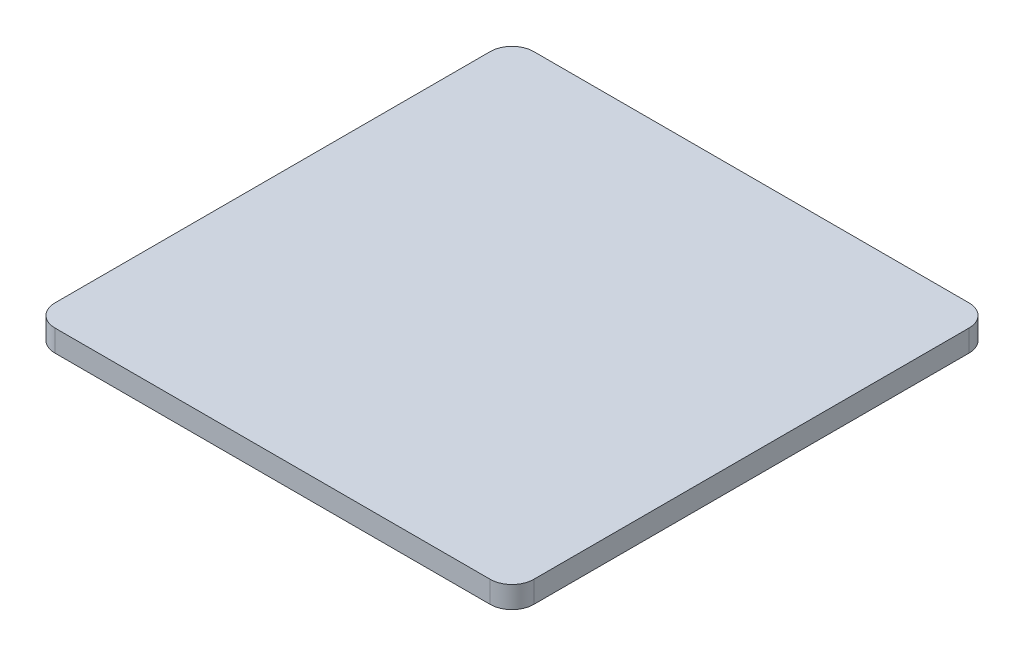
ISO-10303-21;
HEADER;
FILE_DESCRIPTION(('STEP AP214'),'2;1');
FILE_NAME('part.step','',(''),(''),'','','');
FILE_SCHEMA(('AUTOMOTIVE_DESIGN { 1 0 10303 214 1 1 1 1 }'));
ENDSEC;
DATA;
#1=APPLICATION_CONTEXT('core data for automotive mechanical design processes');
#2=APPLICATION_PROTOCOL_DEFINITION('international standard','automotive_design',2000,#1);
#3=PRODUCT_CONTEXT('',#1,'mechanical');
#4=PRODUCT('Part','Part','',(#3));
#5=PRODUCT_RELATED_PRODUCT_CATEGORY('part','',(#4));
#6=PRODUCT_DEFINITION_FORMATION('','',#4);
#7=PRODUCT_DEFINITION_CONTEXT('part definition',#1,'design');
#8=PRODUCT_DEFINITION('design','',#6,#7);
#9=PRODUCT_DEFINITION_SHAPE('','',#8);
#10=(LENGTH_UNIT() NAMED_UNIT(*) SI_UNIT(.MILLI.,.METRE.));
#11=(NAMED_UNIT(*) PLANE_ANGLE_UNIT() SI_UNIT($,.RADIAN.));
#12=(NAMED_UNIT(*) SI_UNIT($,.STERADIAN.) SOLID_ANGLE_UNIT());
#13=UNCERTAINTY_MEASURE_WITH_UNIT(LENGTH_MEASURE(1.E-05),#10,'distance_accuracy_value','');
#14=(GEOMETRIC_REPRESENTATION_CONTEXT(3) GLOBAL_UNCERTAINTY_ASSIGNED_CONTEXT((#13)) GLOBAL_UNIT_ASSIGNED_CONTEXT((#10,
#11,#12)) REPRESENTATION_CONTEXT('',''));
#15=CARTESIAN_POINT('',(0.,0.,0.));
#16=DIRECTION('',(0.,0.,1.));
#17=DIRECTION('',(1.,0.,0.));
#18=AXIS2_PLACEMENT_3D('',#15,#16,#17);
#19=CARTESIAN_POINT('',(110.,10.,110.));
#20=DIRECTION('',(-1.,0.,0.));
#21=DIRECTION('',(0.,0.,1.));
#22=AXIS2_PLACEMENT_3D('',#19,#20,#21);
#23=PLANE('',#22);
#24=DIRECTION('',(0.,0.,-1.));
#25=VECTOR('',#24,1.);
#26=CARTESIAN_POINT('',(110.,10.,110.));
#27=LINE('',#26,#25);
#28=CARTESIAN_POINT('',(110.,10.,100.));
#29=VERTEX_POINT('',#28);
#30=CARTESIAN_POINT('',(110.,10.,-100.));
#31=VERTEX_POINT('',#30);
#32=EDGE_CURVE('E129',#29,#31,#27,.T.);
#33=ORIENTED_EDGE('',*,*,#32,.F.);
#34=DIRECTION('',(0.,-1.,0.));
#35=VECTOR('',#34,1.);
#36=CARTESIAN_POINT('',(110.,10.,100.));
#37=LINE('',#36,#35);
#38=CARTESIAN_POINT('',(110.,0.,100.));
#39=VERTEX_POINT('',#38);
#40=EDGE_CURVE('E155',#29,#39,#37,.T.);
#41=ORIENTED_EDGE('',*,*,#40,.T.);
#42=DIRECTION('',(0.,0.,-1.));
#43=VECTOR('',#42,1.);
#44=CARTESIAN_POINT('',(110.,0.,110.));
#45=LINE('',#44,#43);
#46=CARTESIAN_POINT('',(110.,0.,-100.));
#47=VERTEX_POINT('',#46);
#48=EDGE_CURVE('E161',#39,#47,#45,.T.);
#49=ORIENTED_EDGE('',*,*,#48,.T.);
#50=DIRECTION('',(0.,-1.,0.));
#51=VECTOR('',#50,1.);
#52=CARTESIAN_POINT('',(110.,10.,-100.));
#53=LINE('',#52,#51);
#54=EDGE_CURVE('E153',#47,#31,#53,.F.);
#55=ORIENTED_EDGE('',*,*,#54,.T.);
#56=EDGE_LOOP('',(#33,#41,#49,#55));
#57=FACE_BOUND('',#56,.T.);
#58=ADVANCED_FACE('F37',(#57),#23,.F.);
#59=CARTESIAN_POINT('',(-110.,10.,-110.));
#60=DIRECTION('',(0.,0.,1.));
#61=DIRECTION('',(1.,0.,0.));
#62=AXIS2_PLACEMENT_3D('',#59,#60,#61);
#63=PLANE('',#62);
#64=DIRECTION('',(-1.,0.,0.));
#65=VECTOR('',#64,1.);
#66=CARTESIAN_POINT('',(-110.,10.,-110.));
#67=LINE('',#66,#65);
#68=CARTESIAN_POINT('',(100.,10.,-110.));
#69=VERTEX_POINT('',#68);
#70=CARTESIAN_POINT('',(-100.,10.,-110.));
#71=VERTEX_POINT('',#70);
#72=EDGE_CURVE('E132',#69,#71,#67,.T.);
#73=ORIENTED_EDGE('',*,*,#72,.F.);
#74=DIRECTION('',(0.,-1.,0.));
#75=VECTOR('',#74,1.);
#76=CARTESIAN_POINT('',(100.,10.,-110.));
#77=LINE('',#76,#75);
#78=CARTESIAN_POINT('',(100.,0.,-110.));
#79=VERTEX_POINT('',#78);
#80=EDGE_CURVE('E11',#69,#79,#77,.T.);
#81=ORIENTED_EDGE('',*,*,#80,.T.);
#82=DIRECTION('',(-1.,0.,0.));
#83=VECTOR('',#82,1.);
#84=CARTESIAN_POINT('',(-110.,0.,-110.));
#85=LINE('',#84,#83);
#86=CARTESIAN_POINT('',(-100.,0.,-110.));
#87=VERTEX_POINT('',#86);
#88=EDGE_CURVE('E134',#79,#87,#85,.T.);
#89=ORIENTED_EDGE('',*,*,#88,.T.);
#90=DIRECTION('',(0.,-1.,0.));
#91=VECTOR('',#90,1.);
#92=CARTESIAN_POINT('',(-100.,10.,-110.));
#93=LINE('',#92,#91);
#94=EDGE_CURVE('E45',#87,#71,#93,.F.);
#95=ORIENTED_EDGE('',*,*,#94,.T.);
#96=EDGE_LOOP('',(#73,#81,#89,#95));
#97=FACE_BOUND('',#96,.T.);
#98=ADVANCED_FACE('F180',(#97),#63,.F.);
#99=CARTESIAN_POINT('',(-110.,10.,110.));
#100=DIRECTION('',(1.,0.,0.));
#101=DIRECTION('',(0.,0.,-1.));
#102=AXIS2_PLACEMENT_3D('',#99,#100,#101);
#103=PLANE('',#102);
#104=DIRECTION('',(0.,0.,1.));
#105=VECTOR('',#104,1.);
#106=CARTESIAN_POINT('',(-110.,0.,110.));
#107=LINE('',#106,#105);
#108=CARTESIAN_POINT('',(-110.,0.,-100.));
#109=VERTEX_POINT('',#108);
#110=CARTESIAN_POINT('',(-110.,0.,100.));
#111=VERTEX_POINT('',#110);
#112=EDGE_CURVE('E130',#109,#111,#107,.T.);
#113=ORIENTED_EDGE('',*,*,#112,.T.);
#114=DIRECTION('',(0.,-1.,0.));
#115=VECTOR('',#114,1.);
#116=CARTESIAN_POINT('',(-110.,10.,100.));
#117=LINE('',#116,#115);
#118=CARTESIAN_POINT('',(-110.,10.,100.));
#119=VERTEX_POINT('',#118);
#120=EDGE_CURVE('E108',#111,#119,#117,.F.);
#121=ORIENTED_EDGE('',*,*,#120,.T.);
#122=DIRECTION('',(0.,0.,1.));
#123=VECTOR('',#122,1.);
#124=CARTESIAN_POINT('',(-110.,10.,110.));
#125=LINE('',#124,#123);
#126=CARTESIAN_POINT('',(-110.,10.,-100.));
#127=VERTEX_POINT('',#126);
#128=EDGE_CURVE('E169',#127,#119,#125,.T.);
#129=ORIENTED_EDGE('',*,*,#128,.F.);
#130=DIRECTION('',(0.,-1.,0.));
#131=VECTOR('',#130,1.);
#132=CARTESIAN_POINT('',(-110.,10.,-100.));
#133=LINE('',#132,#131);
#134=EDGE_CURVE('E113',#127,#109,#133,.T.);
#135=ORIENTED_EDGE('',*,*,#134,.T.);
#136=EDGE_LOOP('',(#113,#121,#129,#135));
#137=FACE_BOUND('',#136,.T.);
#138=ADVANCED_FACE('F179',(#137),#103,.F.);
#139=CARTESIAN_POINT('',(-110.,10.,110.));
#140=DIRECTION('',(0.,0.,-1.));
#141=DIRECTION('',(-1.,0.,0.));
#142=AXIS2_PLACEMENT_3D('',#139,#140,#141);
#143=PLANE('',#142);
#144=DIRECTION('',(1.,0.,0.));
#145=VECTOR('',#144,1.);
#146=CARTESIAN_POINT('',(-110.,10.,110.));
#147=LINE('',#146,#145);
#148=CARTESIAN_POINT('',(-100.,10.,110.));
#149=VERTEX_POINT('',#148);
#150=CARTESIAN_POINT('',(100.,10.,110.));
#151=VERTEX_POINT('',#150);
#152=EDGE_CURVE('E123',#149,#151,#147,.T.);
#153=ORIENTED_EDGE('',*,*,#152,.F.);
#154=DIRECTION('',(0.,-1.,0.));
#155=VECTOR('',#154,1.);
#156=CARTESIAN_POINT('',(-100.,10.,110.));
#157=LINE('',#156,#155);
#158=CARTESIAN_POINT('',(-100.,0.,110.));
#159=VERTEX_POINT('',#158);
#160=EDGE_CURVE('E107',#149,#159,#157,.T.);
#161=ORIENTED_EDGE('',*,*,#160,.T.);
#162=DIRECTION('',(1.,0.,0.));
#163=VECTOR('',#162,1.);
#164=CARTESIAN_POINT('',(-110.,0.,110.));
#165=LINE('',#164,#163);
#166=CARTESIAN_POINT('',(100.,0.,110.));
#167=VERTEX_POINT('',#166);
#168=EDGE_CURVE('E120',#159,#167,#165,.T.);
#169=ORIENTED_EDGE('',*,*,#168,.T.);
#170=DIRECTION('',(0.,-1.,0.));
#171=VECTOR('',#170,1.);
#172=CARTESIAN_POINT('',(100.,10.,110.));
#173=LINE('',#172,#171);
#174=EDGE_CURVE('E125',#167,#151,#173,.F.);
#175=ORIENTED_EDGE('',*,*,#174,.T.);
#176=EDGE_LOOP('',(#153,#161,#169,#175));
#177=FACE_BOUND('',#176,.T.);
#178=ADVANCED_FACE('F119',(#177),#143,.F.);
#179=CARTESIAN_POINT('',(0.,10.,0.));
#180=DIRECTION('',(0.,-1.,0.));
#181=DIRECTION('',(0.,0.,-1.));
#182=AXIS2_PLACEMENT_3D('',#179,#180,#181);
#183=PLANE('',#182);
#184=ORIENTED_EDGE('',*,*,#128,.T.);
#185=CARTESIAN_POINT('',(-100.,10.,100.));
#186=DIRECTION('',(0.,-1.,0.));
#187=DIRECTION('',(0.,0.,-1.));
#188=AXIS2_PLACEMENT_3D('',#185,#186,#187);
#189=CIRCLE('',#188,10.);
#190=EDGE_CURVE('E151',#119,#149,#189,.F.);
#191=ORIENTED_EDGE('',*,*,#190,.T.);
#192=ORIENTED_EDGE('',*,*,#152,.T.);
#193=CARTESIAN_POINT('',(100.,10.,100.));
#194=DIRECTION('',(0.,-1.,0.));
#195=DIRECTION('',(0.,0.,-1.));
#196=AXIS2_PLACEMENT_3D('',#193,#194,#195);
#197=CIRCLE('',#196,10.);
#198=EDGE_CURVE('E149',#151,#29,#197,.F.);
#199=ORIENTED_EDGE('',*,*,#198,.T.);
#200=ORIENTED_EDGE('',*,*,#32,.T.);
#201=CARTESIAN_POINT('',(100.,10.,-100.));
#202=DIRECTION('',(0.,-1.,0.));
#203=DIRECTION('',(0.,0.,-1.));
#204=AXIS2_PLACEMENT_3D('',#201,#202,#203);
#205=CIRCLE('',#204,10.);
#206=EDGE_CURVE('E58',#31,#69,#205,.F.);
#207=ORIENTED_EDGE('',*,*,#206,.T.);
#208=ORIENTED_EDGE('',*,*,#72,.T.);
#209=CARTESIAN_POINT('',(-100.,10.,-100.));
#210=DIRECTION('',(0.,-1.,0.));
#211=DIRECTION('',(0.,0.,-1.));
#212=AXIS2_PLACEMENT_3D('',#209,#210,#211);
#213=CIRCLE('',#212,10.);
#214=EDGE_CURVE('E146',#71,#127,#213,.F.);
#215=ORIENTED_EDGE('',*,*,#214,.T.);
#216=EDGE_LOOP('',(#184,#191,#192,#199,#200,#207,#208,#215));
#217=FACE_BOUND('',#216,.T.);
#218=ADVANCED_FACE('F173',(#217),#183,.F.);
#219=CARTESIAN_POINT('',(0.,0.,0.));
#220=DIRECTION('',(0.,-1.,0.));
#221=DIRECTION('',(0.,0.,-1.));
#222=AXIS2_PLACEMENT_3D('',#219,#220,#221);
#223=PLANE('',#222);
#224=ORIENTED_EDGE('',*,*,#168,.F.);
#225=CARTESIAN_POINT('',(-100.,0.,100.));
#226=DIRECTION('',(0.,-1.,0.));
#227=DIRECTION('',(0.,0.,-1.));
#228=AXIS2_PLACEMENT_3D('',#225,#226,#227);
#229=CIRCLE('',#228,10.);
#230=EDGE_CURVE('E103',#159,#111,#229,.T.);
#231=ORIENTED_EDGE('',*,*,#230,.T.);
#232=ORIENTED_EDGE('',*,*,#112,.F.);
#233=CARTESIAN_POINT('',(-100.,0.,-100.));
#234=DIRECTION('',(0.,-1.,0.));
#235=DIRECTION('',(0.,0.,-1.));
#236=AXIS2_PLACEMENT_3D('',#233,#234,#235);
#237=CIRCLE('',#236,10.);
#238=EDGE_CURVE('E124',#109,#87,#237,.T.);
#239=ORIENTED_EDGE('',*,*,#238,.T.);
#240=ORIENTED_EDGE('',*,*,#88,.F.);
#241=CARTESIAN_POINT('',(100.,0.,-100.));
#242=DIRECTION('',(0.,-1.,0.));
#243=DIRECTION('',(0.,0.,-1.));
#244=AXIS2_PLACEMENT_3D('',#241,#242,#243);
#245=CIRCLE('',#244,10.);
#246=EDGE_CURVE('E140',#79,#47,#245,.T.);
#247=ORIENTED_EDGE('',*,*,#246,.T.);
#248=ORIENTED_EDGE('',*,*,#48,.F.);
#249=CARTESIAN_POINT('',(100.,0.,100.));
#250=DIRECTION('',(0.,-1.,0.));
#251=DIRECTION('',(0.,0.,-1.));
#252=AXIS2_PLACEMENT_3D('',#249,#250,#251);
#253=CIRCLE('',#252,10.);
#254=EDGE_CURVE('E114',#39,#167,#253,.T.);
#255=ORIENTED_EDGE('',*,*,#254,.T.);
#256=EDGE_LOOP('',(#224,#231,#232,#239,#240,#247,#248,#255));
#257=FACE_BOUND('',#256,.T.);
#258=ADVANCED_FACE('F127',(#257),#223,.T.);
#259=CARTESIAN_POINT('',(-100.,10.,100.));
#260=DIRECTION('',(0.,-1.,0.));
#261=DIRECTION('',(0.,0.,-1.));
#262=AXIS2_PLACEMENT_3D('',#259,#260,#261);
#263=CYLINDRICAL_SURFACE('',#262,10.);
#264=ORIENTED_EDGE('',*,*,#190,.F.);
#265=ORIENTED_EDGE('',*,*,#120,.F.);
#266=ORIENTED_EDGE('',*,*,#230,.F.);
#267=ORIENTED_EDGE('',*,*,#160,.F.);
#268=EDGE_LOOP('',(#264,#265,#266,#267));
#269=FACE_BOUND('',#268,.T.);
#270=ADVANCED_FACE('F106',(#269),#263,.T.);
#271=CARTESIAN_POINT('',(100.,10.,100.));
#272=DIRECTION('',(0.,-1.,0.));
#273=DIRECTION('',(0.,0.,-1.));
#274=AXIS2_PLACEMENT_3D('',#271,#272,#273);
#275=CYLINDRICAL_SURFACE('',#274,10.);
#276=ORIENTED_EDGE('',*,*,#198,.F.);
#277=ORIENTED_EDGE('',*,*,#174,.F.);
#278=ORIENTED_EDGE('',*,*,#254,.F.);
#279=ORIENTED_EDGE('',*,*,#40,.F.);
#280=EDGE_LOOP('',(#276,#277,#278,#279));
#281=FACE_BOUND('',#280,.T.);
#282=ADVANCED_FACE('F183',(#281),#275,.T.);
#283=CARTESIAN_POINT('',(100.,10.,-100.));
#284=DIRECTION('',(0.,-1.,0.));
#285=DIRECTION('',(0.,0.,-1.));
#286=AXIS2_PLACEMENT_3D('',#283,#284,#285);
#287=CYLINDRICAL_SURFACE('',#286,10.);
#288=ORIENTED_EDGE('',*,*,#206,.F.);
#289=ORIENTED_EDGE('',*,*,#54,.F.);
#290=ORIENTED_EDGE('',*,*,#246,.F.);
#291=ORIENTED_EDGE('',*,*,#80,.F.);
#292=EDGE_LOOP('',(#288,#289,#290,#291));
#293=FACE_BOUND('',#292,.T.);
#294=ADVANCED_FACE('F182',(#293),#287,.T.);
#295=CARTESIAN_POINT('',(-100.,10.,-100.));
#296=DIRECTION('',(0.,-1.,0.));
#297=DIRECTION('',(0.,0.,-1.));
#298=AXIS2_PLACEMENT_3D('',#295,#296,#297);
#299=CYLINDRICAL_SURFACE('',#298,10.);
#300=ORIENTED_EDGE('',*,*,#214,.F.);
#301=ORIENTED_EDGE('',*,*,#94,.F.);
#302=ORIENTED_EDGE('',*,*,#238,.F.);
#303=ORIENTED_EDGE('',*,*,#134,.F.);
#304=EDGE_LOOP('',(#300,#301,#302,#303));
#305=FACE_BOUND('',#304,.T.);
#306=ADVANCED_FACE('F39',(#305),#299,.T.);
#307=CLOSED_SHELL('',(#58,#98,#138,#178,#218,#258,#270,#282,#294,#306));
#308=MANIFOLD_SOLID_BREP('B2',#307);
#309=ADVANCED_BREP_SHAPE_REPRESENTATION('',(#18,#308),#14);
#310=SHAPE_DEFINITION_REPRESENTATION(#9,#309);
ENDSEC;
END-ISO-10303-21;
